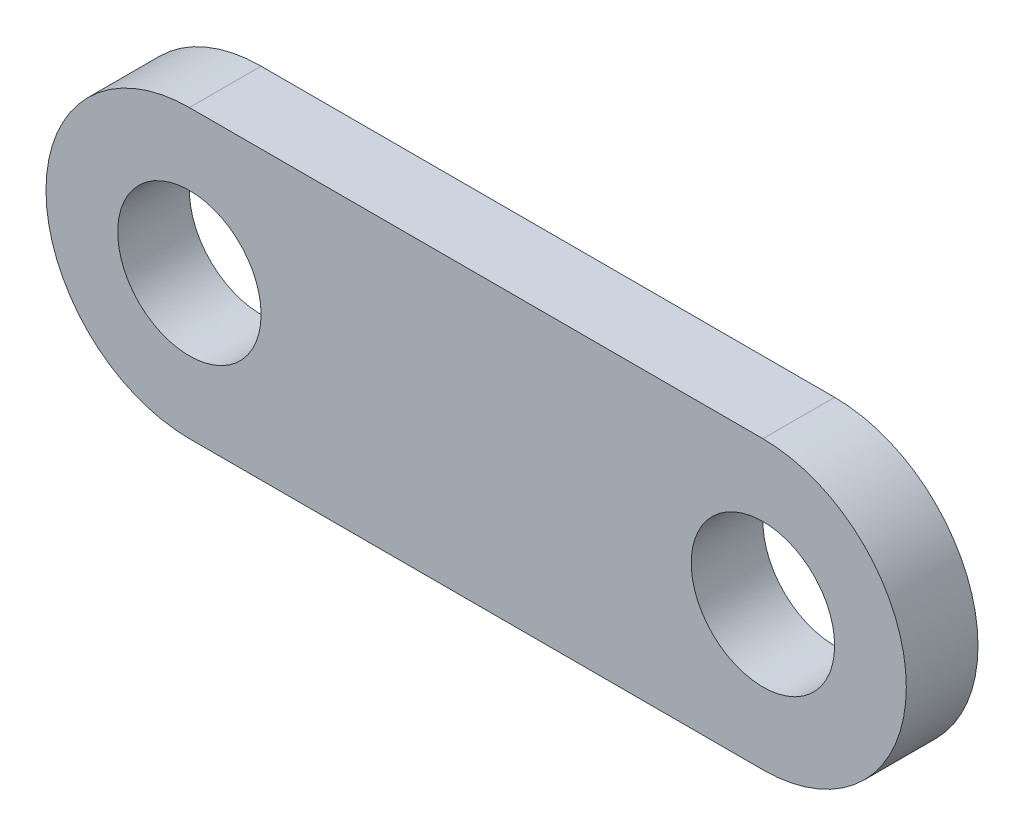
ISO-10303-21;
HEADER;
FILE_DESCRIPTION(('STEP AP214'),'2;1');
FILE_NAME('part.step','',(''),(''),'','','');
FILE_SCHEMA(('AUTOMOTIVE_DESIGN { 1 0 10303 214 1 1 1 1 }'));
ENDSEC;
DATA;
#1=APPLICATION_CONTEXT('core data for automotive mechanical design processes');
#2=APPLICATION_PROTOCOL_DEFINITION('international standard','automotive_design',2000,#1);
#3=PRODUCT_CONTEXT('',#1,'mechanical');
#4=PRODUCT('Part','Part','',(#3));
#5=PRODUCT_RELATED_PRODUCT_CATEGORY('part','',(#4));
#6=PRODUCT_DEFINITION_FORMATION('','',#4);
#7=PRODUCT_DEFINITION_CONTEXT('part definition',#1,'design');
#8=PRODUCT_DEFINITION('design','',#6,#7);
#9=PRODUCT_DEFINITION_SHAPE('','',#8);
#10=(LENGTH_UNIT() NAMED_UNIT(*) SI_UNIT(.MILLI.,.METRE.));
#11=(NAMED_UNIT(*) PLANE_ANGLE_UNIT() SI_UNIT($,.RADIAN.));
#12=(NAMED_UNIT(*) SI_UNIT($,.STERADIAN.) SOLID_ANGLE_UNIT());
#13=UNCERTAINTY_MEASURE_WITH_UNIT(LENGTH_MEASURE(1.E-05),#10,'distance_accuracy_value','');
#14=(GEOMETRIC_REPRESENTATION_CONTEXT(3) GLOBAL_UNCERTAINTY_ASSIGNED_CONTEXT((#13)) GLOBAL_UNIT_ASSIGNED_CONTEXT((#10,
#11,#12)) REPRESENTATION_CONTEXT('',''));
#15=CARTESIAN_POINT('',(0.,0.,0.));
#16=DIRECTION('',(0.,0.,1.));
#17=DIRECTION('',(1.,0.,0.));
#18=AXIS2_PLACEMENT_3D('',#15,#16,#17);
#19=CARTESIAN_POINT('',(-38.6981539199233,2.88659793814433,5.));
#20=DIRECTION('',(0.,0.,1.));
#21=DIRECTION('',(1.,0.,0.));
#22=AXIS2_PLACEMENT_3D('',#19,#20,#21);
#23=PLANE('',#22);
#24=CARTESIAN_POINT('',(-38.6981539199233,2.88659793814433,5.));
#25=DIRECTION('',(0.,0.,1.));
#26=DIRECTION('',(1.,0.,0.));
#27=AXIS2_PLACEMENT_3D('',#24,#25,#26);
#28=CIRCLE('',#27,5.);
#29=CARTESIAN_POINT('',(-33.6981539199233,2.88659793814433,5.));
#30=VERTEX_POINT('',#29);
#31=EDGE_CURVE('E106',#30,#30,#28,.T.);
#32=ORIENTED_EDGE('',*,*,#31,.F.);
#33=EDGE_LOOP('',(#32));
#34=FACE_BOUND('',#33,.T.);
#35=CARTESIAN_POINT('',(-38.6981539199233,2.88659793814433,5.));
#36=DIRECTION('',(0.,0.,1.));
#37=DIRECTION('',(1.,0.,0.));
#38=AXIS2_PLACEMENT_3D('',#35,#36,#37);
#39=CIRCLE('',#38,10.);
#40=CARTESIAN_POINT('',(-38.6981539199233,12.8865979381443,5.));
#41=VERTEX_POINT('',#40);
#42=CARTESIAN_POINT('',(-38.6981539199233,-7.11340206185567,5.));
#43=VERTEX_POINT('',#42);
#44=EDGE_CURVE('E91',#41,#43,#39,.T.);
#45=ORIENTED_EDGE('',*,*,#44,.T.);
#46=DIRECTION('',(1.,0.,0.));
#47=VECTOR('',#46,1.);
#48=CARTESIAN_POINT('',(-38.6981539199233,-7.11340206185567,5.));
#49=LINE('',#48,#47);
#50=CARTESIAN_POINT('',(1.30184608007674,-7.11340206185567,5.));
#51=VERTEX_POINT('',#50);
#52=EDGE_CURVE('E86',#43,#51,#49,.T.);
#53=ORIENTED_EDGE('',*,*,#52,.T.);
#54=CARTESIAN_POINT('',(1.30184608007674,2.88659793814433,5.));
#55=DIRECTION('',(0.,0.,1.));
#56=DIRECTION('',(1.,0.,0.));
#57=AXIS2_PLACEMENT_3D('',#54,#55,#56);
#58=CIRCLE('',#57,10.);
#59=CARTESIAN_POINT('',(1.30184608007674,12.8865979381443,5.));
#60=VERTEX_POINT('',#59);
#61=EDGE_CURVE('E89',#51,#60,#58,.T.);
#62=ORIENTED_EDGE('',*,*,#61,.T.);
#63=DIRECTION('',(-1.,0.,0.));
#64=VECTOR('',#63,1.);
#65=CARTESIAN_POINT('',(-38.6981539199233,12.8865979381443,5.));
#66=LINE('',#65,#64);
#67=EDGE_CURVE('E56',#60,#41,#66,.T.);
#68=ORIENTED_EDGE('',*,*,#67,.T.);
#69=EDGE_LOOP('',(#45,#53,#62,#68));
#70=FACE_BOUND('',#69,.T.);
#71=CARTESIAN_POINT('',(1.30184608007674,2.88659793814433,5.));
#72=DIRECTION('',(0.,0.,1.));
#73=DIRECTION('',(1.,0.,0.));
#74=AXIS2_PLACEMENT_3D('',#71,#72,#73);
#75=CIRCLE('',#74,5.);
#76=CARTESIAN_POINT('',(6.30184608007674,2.88659793814433,5.));
#77=VERTEX_POINT('',#76);
#78=EDGE_CURVE('E121',#77,#77,#75,.T.);
#79=ORIENTED_EDGE('',*,*,#78,.F.);
#80=EDGE_LOOP('',(#79));
#81=FACE_BOUND('',#80,.T.);
#82=ADVANCED_FACE('F39',(#34,#70,#81),#23,.T.);
#83=CARTESIAN_POINT('',(-38.6981539199233,2.88659793814433,0.));
#84=DIRECTION('',(0.,0.,1.));
#85=DIRECTION('',(1.,0.,0.));
#86=AXIS2_PLACEMENT_3D('',#83,#84,#85);
#87=PLANE('',#86);
#88=CARTESIAN_POINT('',(-38.6981539199233,2.88659793814433,0.));
#89=DIRECTION('',(0.,0.,1.));
#90=DIRECTION('',(1.,0.,0.));
#91=AXIS2_PLACEMENT_3D('',#88,#89,#90);
#92=CIRCLE('',#91,10.);
#93=CARTESIAN_POINT('',(-38.6981539199233,12.8865979381443,0.));
#94=VERTEX_POINT('',#93);
#95=CARTESIAN_POINT('',(-38.6981539199233,-7.11340206185567,0.));
#96=VERTEX_POINT('',#95);
#97=EDGE_CURVE('E103',#94,#96,#92,.T.);
#98=ORIENTED_EDGE('',*,*,#97,.F.);
#99=DIRECTION('',(-1.,0.,0.));
#100=VECTOR('',#99,1.);
#101=CARTESIAN_POINT('',(-38.6981539199233,12.8865979381443,0.));
#102=LINE('',#101,#100);
#103=CARTESIAN_POINT('',(1.30184608007674,12.8865979381443,0.));
#104=VERTEX_POINT('',#103);
#105=EDGE_CURVE('E79',#104,#94,#102,.T.);
#106=ORIENTED_EDGE('',*,*,#105,.F.);
#107=CARTESIAN_POINT('',(1.30184608007674,2.88659793814433,0.));
#108=DIRECTION('',(0.,0.,1.));
#109=DIRECTION('',(1.,0.,0.));
#110=AXIS2_PLACEMENT_3D('',#107,#108,#109);
#111=CIRCLE('',#110,10.);
#112=CARTESIAN_POINT('',(1.30184608007674,-7.11340206185567,0.));
#113=VERTEX_POINT('',#112);
#114=EDGE_CURVE('E73',#113,#104,#111,.T.);
#115=ORIENTED_EDGE('',*,*,#114,.F.);
#116=DIRECTION('',(1.,0.,0.));
#117=VECTOR('',#116,1.);
#118=CARTESIAN_POINT('',(-38.6981539199233,-7.11340206185567,0.));
#119=LINE('',#118,#117);
#120=EDGE_CURVE('E95',#96,#113,#119,.T.);
#121=ORIENTED_EDGE('',*,*,#120,.F.);
#122=EDGE_LOOP('',(#98,#106,#115,#121));
#123=FACE_BOUND('',#122,.T.);
#124=CARTESIAN_POINT('',(-38.6981539199233,2.88659793814433,0.));
#125=DIRECTION('',(0.,0.,1.));
#126=DIRECTION('',(1.,0.,0.));
#127=AXIS2_PLACEMENT_3D('',#124,#125,#126);
#128=CIRCLE('',#127,5.);
#129=CARTESIAN_POINT('',(-33.6981539199233,2.88659793814433,0.));
#130=VERTEX_POINT('',#129);
#131=EDGE_CURVE('E118',#130,#130,#128,.T.);
#132=ORIENTED_EDGE('',*,*,#131,.T.);
#133=EDGE_LOOP('',(#132));
#134=FACE_BOUND('',#133,.T.);
#135=CARTESIAN_POINT('',(1.30184608007674,2.88659793814433,0.));
#136=DIRECTION('',(0.,0.,1.));
#137=DIRECTION('',(1.,0.,0.));
#138=AXIS2_PLACEMENT_3D('',#135,#136,#137);
#139=CIRCLE('',#138,5.);
#140=CARTESIAN_POINT('',(6.30184608007674,2.88659793814433,0.));
#141=VERTEX_POINT('',#140);
#142=EDGE_CURVE('E124',#141,#141,#139,.T.);
#143=ORIENTED_EDGE('',*,*,#142,.T.);
#144=EDGE_LOOP('',(#143));
#145=FACE_BOUND('',#144,.T.);
#146=ADVANCED_FACE('F114',(#123,#134,#145),#87,.F.);
#147=CARTESIAN_POINT('',(-38.6981539199233,2.88659793814433,5.));
#148=DIRECTION('',(0.,0.,-1.));
#149=DIRECTION('',(-1.,0.,0.));
#150=AXIS2_PLACEMENT_3D('',#147,#148,#149);
#151=CYLINDRICAL_SURFACE('',#150,10.);
#152=ORIENTED_EDGE('',*,*,#97,.T.);
#153=DIRECTION('',(0.,0.,-1.));
#154=VECTOR('',#153,1.);
#155=CARTESIAN_POINT('',(-38.6981539199233,-7.11340206185567,5.));
#156=LINE('',#155,#154);
#157=EDGE_CURVE('E11',#43,#96,#156,.T.);
#158=ORIENTED_EDGE('',*,*,#157,.F.);
#159=ORIENTED_EDGE('',*,*,#44,.F.);
#160=DIRECTION('',(0.,0.,-1.));
#161=VECTOR('',#160,1.);
#162=CARTESIAN_POINT('',(-38.6981539199233,12.8865979381443,5.));
#163=LINE('',#162,#161);
#164=EDGE_CURVE('E99',#41,#94,#163,.T.);
#165=ORIENTED_EDGE('',*,*,#164,.T.);
#166=EDGE_LOOP('',(#152,#158,#159,#165));
#167=FACE_BOUND('',#166,.T.);
#168=ADVANCED_FACE('F41',(#167),#151,.T.);
#169=CARTESIAN_POINT('',(-38.6981539199233,-7.11340206185567,5.));
#170=DIRECTION('',(0.,1.,0.));
#171=DIRECTION('',(0.,0.,1.));
#172=AXIS2_PLACEMENT_3D('',#169,#170,#171);
#173=PLANE('',#172);
#174=ORIENTED_EDGE('',*,*,#120,.T.);
#175=DIRECTION('',(0.,0.,-1.));
#176=VECTOR('',#175,1.);
#177=CARTESIAN_POINT('',(1.30184608007674,-7.11340206185567,5.));
#178=LINE('',#177,#176);
#179=EDGE_CURVE('E48',#51,#113,#178,.T.);
#180=ORIENTED_EDGE('',*,*,#179,.F.);
#181=ORIENTED_EDGE('',*,*,#52,.F.);
#182=ORIENTED_EDGE('',*,*,#157,.T.);
#183=EDGE_LOOP('',(#174,#180,#181,#182));
#184=FACE_BOUND('',#183,.T.);
#185=ADVANCED_FACE('F94',(#184),#173,.F.);
#186=CARTESIAN_POINT('',(1.30184608007674,2.88659793814433,5.));
#187=DIRECTION('',(0.,0.,-1.));
#188=DIRECTION('',(-1.,0.,0.));
#189=AXIS2_PLACEMENT_3D('',#186,#187,#188);
#190=CYLINDRICAL_SURFACE('',#189,10.);
#191=ORIENTED_EDGE('',*,*,#114,.T.);
#192=DIRECTION('',(0.,0.,-1.));
#193=VECTOR('',#192,1.);
#194=CARTESIAN_POINT('',(1.30184608007674,12.8865979381443,5.));
#195=LINE('',#194,#193);
#196=EDGE_CURVE('E96',#60,#104,#195,.T.);
#197=ORIENTED_EDGE('',*,*,#196,.F.);
#198=ORIENTED_EDGE('',*,*,#61,.F.);
#199=ORIENTED_EDGE('',*,*,#179,.T.);
#200=EDGE_LOOP('',(#191,#197,#198,#199));
#201=FACE_BOUND('',#200,.T.);
#202=ADVANCED_FACE('F97',(#201),#190,.T.);
#203=CARTESIAN_POINT('',(-38.6981539199233,12.8865979381443,5.));
#204=DIRECTION('',(0.,-1.,0.));
#205=DIRECTION('',(0.,0.,-1.));
#206=AXIS2_PLACEMENT_3D('',#203,#204,#205);
#207=PLANE('',#206);
#208=ORIENTED_EDGE('',*,*,#105,.T.);
#209=ORIENTED_EDGE('',*,*,#164,.F.);
#210=ORIENTED_EDGE('',*,*,#67,.F.);
#211=ORIENTED_EDGE('',*,*,#196,.T.);
#212=EDGE_LOOP('',(#208,#209,#210,#211));
#213=FACE_BOUND('',#212,.T.);
#214=ADVANCED_FACE('F111',(#213),#207,.F.);
#215=CARTESIAN_POINT('',(-38.6981539199233,2.88659793814433,5.));
#216=DIRECTION('',(0.,0.,-1.));
#217=DIRECTION('',(-1.,0.,0.));
#218=AXIS2_PLACEMENT_3D('',#215,#216,#217);
#219=CYLINDRICAL_SURFACE('',#218,5.);
#220=ORIENTED_EDGE('',*,*,#31,.T.);
#221=EDGE_LOOP('',(#220));
#222=FACE_BOUND('',#221,.T.);
#223=ORIENTED_EDGE('',*,*,#131,.F.);
#224=EDGE_LOOP('',(#223));
#225=FACE_BOUND('',#224,.T.);
#226=ADVANCED_FACE('F141',(#222,#225),#219,.F.);
#227=CARTESIAN_POINT('',(1.30184608007674,2.88659793814433,5.));
#228=DIRECTION('',(0.,0.,-1.));
#229=DIRECTION('',(-1.,0.,0.));
#230=AXIS2_PLACEMENT_3D('',#227,#228,#229);
#231=CYLINDRICAL_SURFACE('',#230,5.);
#232=ORIENTED_EDGE('',*,*,#78,.T.);
#233=EDGE_LOOP('',(#232));
#234=FACE_BOUND('',#233,.T.);
#235=ORIENTED_EDGE('',*,*,#142,.F.);
#236=EDGE_LOOP('',(#235));
#237=FACE_BOUND('',#236,.T.);
#238=ADVANCED_FACE('F130',(#234,#237),#231,.F.);
#239=CLOSED_SHELL('',(#82,#146,#168,#185,#202,#214,#226,#238));
#240=MANIFOLD_SOLID_BREP('B2',#239);
#241=ADVANCED_BREP_SHAPE_REPRESENTATION('',(#18,#240),#14);
#242=SHAPE_DEFINITION_REPRESENTATION(#9,#241);
ENDSEC;
END-ISO-10303-21;
